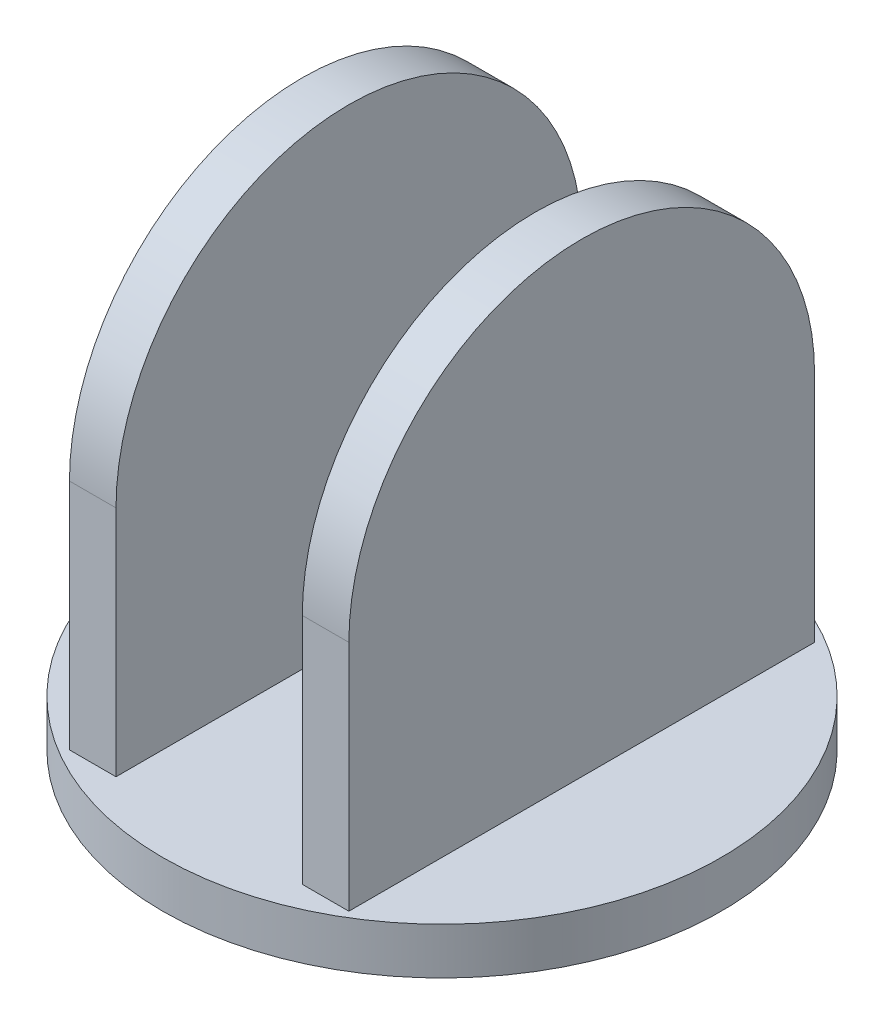
ISO-10303-21;
HEADER;
FILE_DESCRIPTION(('STEP AP214'),'2;1');
FILE_NAME('part.step','',(''),(''),'','','');
FILE_SCHEMA(('AUTOMOTIVE_DESIGN { 1 0 10303 214 1 1 1 1 }'));
ENDSEC;
DATA;
#1=APPLICATION_CONTEXT('core data for automotive mechanical design processes');
#2=APPLICATION_PROTOCOL_DEFINITION('international standard','automotive_design',2000,#1);
#3=PRODUCT_CONTEXT('',#1,'mechanical');
#4=PRODUCT('Part','Part','',(#3));
#5=PRODUCT_RELATED_PRODUCT_CATEGORY('part','',(#4));
#6=PRODUCT_DEFINITION_FORMATION('','',#4);
#7=PRODUCT_DEFINITION_CONTEXT('part definition',#1,'design');
#8=PRODUCT_DEFINITION('design','',#6,#7);
#9=PRODUCT_DEFINITION_SHAPE('','',#8);
#10=(LENGTH_UNIT() NAMED_UNIT(*) SI_UNIT(.MILLI.,.METRE.));
#11=(NAMED_UNIT(*) PLANE_ANGLE_UNIT() SI_UNIT($,.RADIAN.));
#12=(NAMED_UNIT(*) SI_UNIT($,.STERADIAN.) SOLID_ANGLE_UNIT());
#13=UNCERTAINTY_MEASURE_WITH_UNIT(LENGTH_MEASURE(1.E-05),#10,'distance_accuracy_value','');
#14=(GEOMETRIC_REPRESENTATION_CONTEXT(3) GLOBAL_UNCERTAINTY_ASSIGNED_CONTEXT((#13)) GLOBAL_UNIT_ASSIGNED_CONTEXT((#10,
#11,#12)) REPRESENTATION_CONTEXT('',''));
#15=CARTESIAN_POINT('',(0.,0.,0.));
#16=DIRECTION('',(0.,0.,1.));
#17=DIRECTION('',(1.,0.,0.));
#18=AXIS2_PLACEMENT_3D('',#15,#16,#17);
#19=CARTESIAN_POINT('',(0.,-10.,0.));
#20=DIRECTION('',(0.,1.,0.));
#21=DIRECTION('',(0.,0.,1.));
#22=AXIS2_PLACEMENT_3D('',#19,#20,#21);
#23=CYLINDRICAL_SURFACE('',#22,60.);
#24=CARTESIAN_POINT('',(0.,-10.,0.));
#25=DIRECTION('',(0.,1.,0.));
#26=DIRECTION('',(0.,0.,1.));
#27=AXIS2_PLACEMENT_3D('',#24,#25,#26);
#28=CIRCLE('',#27,60.);
#29=CARTESIAN_POINT('',(0.,-10.,60.));
#30=VERTEX_POINT('',#29);
#31=EDGE_CURVE('E11',#30,#30,#28,.T.);
#32=ORIENTED_EDGE('',*,*,#31,.T.);
#33=EDGE_LOOP('',(#32));
#34=FACE_BOUND('',#33,.T.);
#35=CARTESIAN_POINT('',(0.,0.,0.));
#36=DIRECTION('',(0.,1.,0.));
#37=DIRECTION('',(0.,0.,1.));
#38=AXIS2_PLACEMENT_3D('',#35,#36,#37);
#39=CIRCLE('',#38,60.);
#40=CARTESIAN_POINT('',(0.,0.,60.));
#41=VERTEX_POINT('',#40);
#42=EDGE_CURVE('E40',#41,#41,#39,.T.);
#43=ORIENTED_EDGE('',*,*,#42,.F.);
#44=EDGE_LOOP('',(#43));
#45=FACE_BOUND('',#44,.T.);
#46=ADVANCED_FACE('F37',(#34,#45),#23,.T.);
#47=CARTESIAN_POINT('',(0.,-10.,0.));
#48=DIRECTION('',(0.,1.,0.));
#49=DIRECTION('',(0.,0.,1.));
#50=AXIS2_PLACEMENT_3D('',#47,#48,#49);
#51=PLANE('',#50);
#52=ORIENTED_EDGE('',*,*,#31,.F.);
#53=EDGE_LOOP('',(#52));
#54=FACE_BOUND('',#53,.T.);
#55=ADVANCED_FACE('F166',(#54),#51,.F.);
#56=CARTESIAN_POINT('',(0.,0.,0.));
#57=DIRECTION('',(0.,1.,0.));
#58=DIRECTION('',(0.,0.,1.));
#59=AXIS2_PLACEMENT_3D('',#56,#57,#58);
#60=PLANE('',#59);
#61=DIRECTION('',(0.,0.,-1.));
#62=VECTOR('',#61,1.);
#63=CARTESIAN_POINT('',(-30.,0.,50.));
#64=LINE('',#63,#62);
#65=CARTESIAN_POINT('',(-30.,0.,50.));
#66=VERTEX_POINT('',#65);
#67=CARTESIAN_POINT('',(-30.,0.,-50.));
#68=VERTEX_POINT('',#67);
#69=EDGE_CURVE('E104',#66,#68,#64,.T.);
#70=ORIENTED_EDGE('',*,*,#69,.T.);
#71=DIRECTION('',(1.,0.,0.));
#72=VECTOR('',#71,1.);
#73=CARTESIAN_POINT('',(-30.,0.,-50.));
#74=LINE('',#73,#72);
#75=CARTESIAN_POINT('',(-20.,0.,-50.));
#76=VERTEX_POINT('',#75);
#77=EDGE_CURVE('E286',#68,#76,#74,.T.);
#78=ORIENTED_EDGE('',*,*,#77,.T.);
#79=DIRECTION('',(0.,0.,-1.));
#80=VECTOR('',#79,1.);
#81=CARTESIAN_POINT('',(-20.,0.,0.));
#82=LINE('',#81,#80);
#83=CARTESIAN_POINT('',(-20.,0.,50.));
#84=VERTEX_POINT('',#83);
#85=EDGE_CURVE('E115',#84,#76,#82,.T.);
#86=ORIENTED_EDGE('',*,*,#85,.F.);
#87=DIRECTION('',(1.,0.,0.));
#88=VECTOR('',#87,1.);
#89=CARTESIAN_POINT('',(-30.,0.,50.));
#90=LINE('',#89,#88);
#91=EDGE_CURVE('E119',#66,#84,#90,.T.);
#92=ORIENTED_EDGE('',*,*,#91,.F.);
#93=EDGE_LOOP('',(#70,#78,#86,#92));
#94=FACE_BOUND('',#93,.T.);
#95=DIRECTION('',(0.,0.,-1.));
#96=VECTOR('',#95,1.);
#97=CARTESIAN_POINT('',(30.,0.,50.));
#98=LINE('',#97,#96);
#99=CARTESIAN_POINT('',(30.,0.,50.));
#100=VERTEX_POINT('',#99);
#101=CARTESIAN_POINT('',(30.,0.,-50.));
#102=VERTEX_POINT('',#101);
#103=EDGE_CURVE('E134',#100,#102,#98,.T.);
#104=ORIENTED_EDGE('',*,*,#103,.F.);
#105=DIRECTION('',(-1.,0.,0.));
#106=VECTOR('',#105,1.);
#107=CARTESIAN_POINT('',(30.,0.,50.));
#108=LINE('',#107,#106);
#109=CARTESIAN_POINT('',(20.,0.,50.));
#110=VERTEX_POINT('',#109);
#111=EDGE_CURVE('E142',#100,#110,#108,.T.);
#112=ORIENTED_EDGE('',*,*,#111,.T.);
#113=DIRECTION('',(0.,0.,-1.));
#114=VECTOR('',#113,1.);
#115=CARTESIAN_POINT('',(20.,0.,0.));
#116=LINE('',#115,#114);
#117=CARTESIAN_POINT('',(20.,0.,-50.));
#118=VERTEX_POINT('',#117);
#119=EDGE_CURVE('E126',#110,#118,#116,.T.);
#120=ORIENTED_EDGE('',*,*,#119,.T.);
#121=DIRECTION('',(-1.,0.,0.));
#122=VECTOR('',#121,1.);
#123=CARTESIAN_POINT('',(30.,0.,-50.));
#124=LINE('',#123,#122);
#125=EDGE_CURVE('E157',#102,#118,#124,.T.);
#126=ORIENTED_EDGE('',*,*,#125,.F.);
#127=EDGE_LOOP('',(#104,#112,#120,#126));
#128=FACE_BOUND('',#127,.T.);
#129=ORIENTED_EDGE('',*,*,#42,.T.);
#130=EDGE_LOOP('',(#129));
#131=FACE_BOUND('',#130,.T.);
#132=ADVANCED_FACE('F124',(#94,#128,#131),#60,.T.);
#133=CARTESIAN_POINT('',(30.,0.,-50.));
#134=DIRECTION('',(0.,0.,1.));
#135=DIRECTION('',(1.,0.,0.));
#136=AXIS2_PLACEMENT_3D('',#133,#134,#135);
#137=PLANE('',#136);
#138=DIRECTION('',(0.,1.,0.));
#139=VECTOR('',#138,1.);
#140=CARTESIAN_POINT('',(20.,0.,-50.));
#141=LINE('',#140,#139);
#142=CARTESIAN_POINT('',(20.,50.,-50.));
#143=VERTEX_POINT('',#142);
#144=EDGE_CURVE('E59',#118,#143,#141,.T.);
#145=ORIENTED_EDGE('',*,*,#144,.T.);
#146=DIRECTION('',(-1.,0.,0.));
#147=VECTOR('',#146,1.);
#148=CARTESIAN_POINT('',(30.,50.,-50.));
#149=LINE('',#148,#147);
#150=CARTESIAN_POINT('',(30.,50.,-50.));
#151=VERTEX_POINT('',#150);
#152=EDGE_CURVE('E154',#151,#143,#149,.T.);
#153=ORIENTED_EDGE('',*,*,#152,.F.);
#154=DIRECTION('',(0.,1.,0.));
#155=VECTOR('',#154,1.);
#156=CARTESIAN_POINT('',(30.,0.,-50.));
#157=LINE('',#156,#155);
#158=EDGE_CURVE('E136',#102,#151,#157,.T.);
#159=ORIENTED_EDGE('',*,*,#158,.F.);
#160=ORIENTED_EDGE('',*,*,#125,.T.);
#161=EDGE_LOOP('',(#145,#153,#159,#160));
#162=FACE_BOUND('',#161,.T.);
#163=ADVANCED_FACE('F177',(#162),#137,.F.);
#164=CARTESIAN_POINT('',(30.,50.,0.));
#165=DIRECTION('',(-1.,0.,0.));
#166=DIRECTION('',(0.,0.,1.));
#167=AXIS2_PLACEMENT_3D('',#164,#165,#166);
#168=CYLINDRICAL_SURFACE('',#167,50.);
#169=CARTESIAN_POINT('',(20.,50.,0.));
#170=DIRECTION('',(1.,0.,0.));
#171=DIRECTION('',(0.,0.,-1.));
#172=AXIS2_PLACEMENT_3D('',#169,#170,#171);
#173=CIRCLE('',#172,50.);
#174=CARTESIAN_POINT('',(20.,50.,50.));
#175=VERTEX_POINT('',#174);
#176=EDGE_CURVE('E145',#143,#175,#173,.T.);
#177=ORIENTED_EDGE('',*,*,#176,.T.);
#178=DIRECTION('',(-1.,0.,0.));
#179=VECTOR('',#178,1.);
#180=CARTESIAN_POINT('',(30.,50.,50.));
#181=LINE('',#180,#179);
#182=CARTESIAN_POINT('',(30.,50.,50.));
#183=VERTEX_POINT('',#182);
#184=EDGE_CURVE('E151',#183,#175,#181,.T.);
#185=ORIENTED_EDGE('',*,*,#184,.F.);
#186=CARTESIAN_POINT('',(30.,50.,0.));
#187=DIRECTION('',(1.,0.,0.));
#188=DIRECTION('',(0.,0.,-1.));
#189=AXIS2_PLACEMENT_3D('',#186,#187,#188);
#190=CIRCLE('',#189,50.);
#191=EDGE_CURVE('E139',#151,#183,#190,.T.);
#192=ORIENTED_EDGE('',*,*,#191,.F.);
#193=ORIENTED_EDGE('',*,*,#152,.T.);
#194=EDGE_LOOP('',(#177,#185,#192,#193));
#195=FACE_BOUND('',#194,.T.);
#196=ADVANCED_FACE('F181',(#195),#168,.T.);
#197=CARTESIAN_POINT('',(30.,50.,50.));
#198=DIRECTION('',(0.,0.,-1.));
#199=DIRECTION('',(-1.,0.,0.));
#200=AXIS2_PLACEMENT_3D('',#197,#198,#199);
#201=PLANE('',#200);
#202=DIRECTION('',(0.,-1.,0.));
#203=VECTOR('',#202,1.);
#204=CARTESIAN_POINT('',(20.,50.,50.));
#205=LINE('',#204,#203);
#206=EDGE_CURVE('E137',#175,#110,#205,.T.);
#207=ORIENTED_EDGE('',*,*,#206,.T.);
#208=ORIENTED_EDGE('',*,*,#111,.F.);
#209=DIRECTION('',(0.,-1.,0.));
#210=VECTOR('',#209,1.);
#211=CARTESIAN_POINT('',(30.,50.,50.));
#212=LINE('',#211,#210);
#213=EDGE_CURVE('E141',#183,#100,#212,.T.);
#214=ORIENTED_EDGE('',*,*,#213,.F.);
#215=ORIENTED_EDGE('',*,*,#184,.T.);
#216=EDGE_LOOP('',(#207,#208,#214,#215));
#217=FACE_BOUND('',#216,.T.);
#218=ADVANCED_FACE('F184',(#217),#201,.F.);
#219=CARTESIAN_POINT('',(30.,50.,0.));
#220=DIRECTION('',(1.,0.,0.));
#221=DIRECTION('',(0.,0.,-1.));
#222=AXIS2_PLACEMENT_3D('',#219,#220,#221);
#223=PLANE('',#222);
#224=ORIENTED_EDGE('',*,*,#103,.T.);
#225=ORIENTED_EDGE('',*,*,#158,.T.);
#226=ORIENTED_EDGE('',*,*,#191,.T.);
#227=ORIENTED_EDGE('',*,*,#213,.T.);
#228=EDGE_LOOP('',(#224,#225,#226,#227));
#229=FACE_BOUND('',#228,.T.);
#230=ADVANCED_FACE('F188',(#229),#223,.T.);
#231=CARTESIAN_POINT('',(20.,50.,0.));
#232=DIRECTION('',(1.,0.,0.));
#233=DIRECTION('',(0.,0.,-1.));
#234=AXIS2_PLACEMENT_3D('',#231,#232,#233);
#235=PLANE('',#234);
#236=ORIENTED_EDGE('',*,*,#119,.F.);
#237=ORIENTED_EDGE('',*,*,#206,.F.);
#238=ORIENTED_EDGE('',*,*,#176,.F.);
#239=ORIENTED_EDGE('',*,*,#144,.F.);
#240=EDGE_LOOP('',(#236,#237,#238,#239));
#241=FACE_BOUND('',#240,.T.);
#242=ADVANCED_FACE('F190',(#241),#235,.F.);
#243=CARTESIAN_POINT('',(-30.,50.,50.));
#244=DIRECTION('',(0.,0.,1.));
#245=DIRECTION('',(1.,0.,0.));
#246=AXIS2_PLACEMENT_3D('',#243,#244,#245);
#247=PLANE('',#246);
#248=DIRECTION('',(0.,-1.,0.));
#249=VECTOR('',#248,1.);
#250=CARTESIAN_POINT('',(-20.,50.,50.));
#251=LINE('',#250,#249);
#252=CARTESIAN_POINT('',(-20.,50.,50.));
#253=VERTEX_POINT('',#252);
#254=EDGE_CURVE('E51',#253,#84,#251,.T.);
#255=ORIENTED_EDGE('',*,*,#254,.F.);
#256=DIRECTION('',(1.,0.,0.));
#257=VECTOR('',#256,1.);
#258=CARTESIAN_POINT('',(-30.,50.,50.));
#259=LINE('',#258,#257);
#260=CARTESIAN_POINT('',(-30.,50.,50.));
#261=VERTEX_POINT('',#260);
#262=EDGE_CURVE('E121',#261,#253,#259,.T.);
#263=ORIENTED_EDGE('',*,*,#262,.F.);
#264=DIRECTION('',(0.,-1.,0.));
#265=VECTOR('',#264,1.);
#266=CARTESIAN_POINT('',(-30.,50.,50.));
#267=LINE('',#266,#265);
#268=EDGE_CURVE('E108',#261,#66,#267,.T.);
#269=ORIENTED_EDGE('',*,*,#268,.T.);
#270=ORIENTED_EDGE('',*,*,#91,.T.);
#271=EDGE_LOOP('',(#255,#263,#269,#270));
#272=FACE_BOUND('',#271,.T.);
#273=ADVANCED_FACE('F118',(#272),#247,.T.);
#274=CARTESIAN_POINT('',(-30.,50.,0.));
#275=DIRECTION('',(1.,0.,0.));
#276=DIRECTION('',(0.,0.,-1.));
#277=AXIS2_PLACEMENT_3D('',#274,#275,#276);
#278=CYLINDRICAL_SURFACE('',#277,50.);
#279=CARTESIAN_POINT('',(-20.,50.,0.));
#280=DIRECTION('',(1.,0.,0.));
#281=DIRECTION('',(0.,0.,-1.));
#282=AXIS2_PLACEMENT_3D('',#279,#280,#281);
#283=CIRCLE('',#282,50.);
#284=CARTESIAN_POINT('',(-20.,50.,-50.));
#285=VERTEX_POINT('',#284);
#286=EDGE_CURVE('E288',#285,#253,#283,.T.);
#287=ORIENTED_EDGE('',*,*,#286,.F.);
#288=DIRECTION('',(1.,0.,0.));
#289=VECTOR('',#288,1.);
#290=CARTESIAN_POINT('',(-30.,50.,-50.));
#291=LINE('',#290,#289);
#292=CARTESIAN_POINT('',(-30.,50.,-50.));
#293=VERTEX_POINT('',#292);
#294=EDGE_CURVE('E130',#293,#285,#291,.T.);
#295=ORIENTED_EDGE('',*,*,#294,.F.);
#296=CARTESIAN_POINT('',(-30.,50.,0.));
#297=DIRECTION('',(1.,0.,0.));
#298=DIRECTION('',(0.,0.,-1.));
#299=AXIS2_PLACEMENT_3D('',#296,#297,#298);
#300=CIRCLE('',#299,50.);
#301=EDGE_CURVE('E122',#293,#261,#300,.T.);
#302=ORIENTED_EDGE('',*,*,#301,.T.);
#303=ORIENTED_EDGE('',*,*,#262,.T.);
#304=EDGE_LOOP('',(#287,#295,#302,#303));
#305=FACE_BOUND('',#304,.T.);
#306=ADVANCED_FACE('F198',(#305),#278,.T.);
#307=CARTESIAN_POINT('',(-30.,0.,-50.));
#308=DIRECTION('',(0.,0.,-1.));
#309=DIRECTION('',(-1.,0.,0.));
#310=AXIS2_PLACEMENT_3D('',#307,#308,#309);
#311=PLANE('',#310);
#312=DIRECTION('',(0.,1.,0.));
#313=VECTOR('',#312,1.);
#314=CARTESIAN_POINT('',(-20.,0.,-50.));
#315=LINE('',#314,#313);
#316=EDGE_CURVE('E285',#76,#285,#315,.T.);
#317=ORIENTED_EDGE('',*,*,#316,.F.);
#318=ORIENTED_EDGE('',*,*,#77,.F.);
#319=DIRECTION('',(0.,1.,0.));
#320=VECTOR('',#319,1.);
#321=CARTESIAN_POINT('',(-30.,0.,-50.));
#322=LINE('',#321,#320);
#323=EDGE_CURVE('E111',#68,#293,#322,.T.);
#324=ORIENTED_EDGE('',*,*,#323,.T.);
#325=ORIENTED_EDGE('',*,*,#294,.T.);
#326=EDGE_LOOP('',(#317,#318,#324,#325));
#327=FACE_BOUND('',#326,.T.);
#328=ADVANCED_FACE('F201',(#327),#311,.T.);
#329=CARTESIAN_POINT('',(-30.,50.,0.));
#330=DIRECTION('',(-1.,0.,0.));
#331=DIRECTION('',(0.,0.,-1.));
#332=AXIS2_PLACEMENT_3D('',#329,#330,#331);
#333=PLANE('',#332);
#334=ORIENTED_EDGE('',*,*,#69,.F.);
#335=ORIENTED_EDGE('',*,*,#268,.F.);
#336=ORIENTED_EDGE('',*,*,#301,.F.);
#337=ORIENTED_EDGE('',*,*,#323,.F.);
#338=EDGE_LOOP('',(#334,#335,#336,#337));
#339=FACE_BOUND('',#338,.T.);
#340=ADVANCED_FACE('F106',(#339),#333,.T.);
#341=CARTESIAN_POINT('',(-20.,50.,0.));
#342=DIRECTION('',(-1.,0.,0.));
#343=DIRECTION('',(0.,0.,-1.));
#344=AXIS2_PLACEMENT_3D('',#341,#342,#343);
#345=PLANE('',#344);
#346=ORIENTED_EDGE('',*,*,#254,.T.);
#347=ORIENTED_EDGE('',*,*,#85,.T.);
#348=ORIENTED_EDGE('',*,*,#316,.T.);
#349=ORIENTED_EDGE('',*,*,#286,.T.);
#350=EDGE_LOOP('',(#346,#347,#348,#349));
#351=FACE_BOUND('',#350,.T.);
#352=ADVANCED_FACE('F206',(#351),#345,.F.);
#353=CLOSED_SHELL('',(#46,#55,#132,#163,#196,#218,#230,#242,#273,#306,#328,#340,#352));
#354=MANIFOLD_SOLID_BREP('B2',#353);
#355=ADVANCED_BREP_SHAPE_REPRESENTATION('',(#18,#354),#14);
#356=SHAPE_DEFINITION_REPRESENTATION(#9,#355);
ENDSEC;
END-ISO-10303-21;
